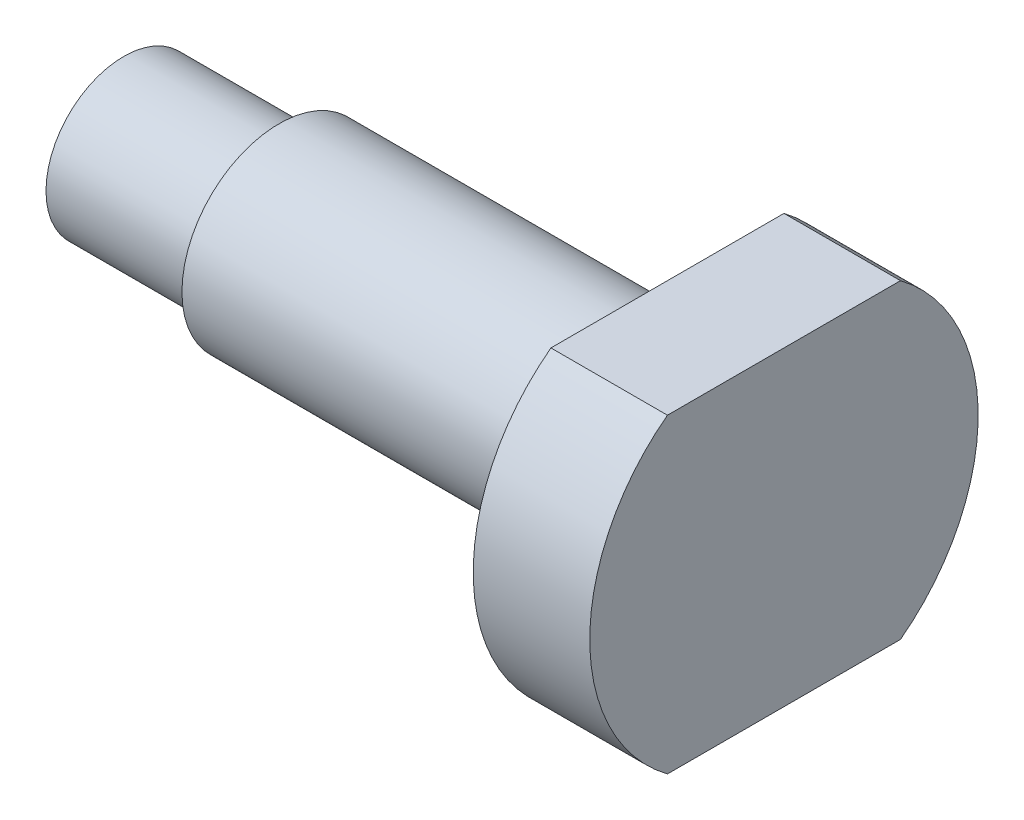
ISO-10303-21;
HEADER;
FILE_DESCRIPTION(('STEP AP214'),'2;1');
FILE_NAME('part.step','',(''),(''),'','','');
FILE_SCHEMA(('AUTOMOTIVE_DESIGN { 1 0 10303 214 1 1 1 1 }'));
ENDSEC;
DATA;
#1=APPLICATION_CONTEXT('core data for automotive mechanical design processes');
#2=APPLICATION_PROTOCOL_DEFINITION('international standard','automotive_design',2000,#1);
#3=PRODUCT_CONTEXT('',#1,'mechanical');
#4=PRODUCT('Part','Part','',(#3));
#5=PRODUCT_RELATED_PRODUCT_CATEGORY('part','',(#4));
#6=PRODUCT_DEFINITION_FORMATION('','',#4);
#7=PRODUCT_DEFINITION_CONTEXT('part definition',#1,'design');
#8=PRODUCT_DEFINITION('design','',#6,#7);
#9=PRODUCT_DEFINITION_SHAPE('','',#8);
#10=(LENGTH_UNIT() NAMED_UNIT(*) SI_UNIT(.MILLI.,.METRE.));
#11=(NAMED_UNIT(*) PLANE_ANGLE_UNIT() SI_UNIT($,.RADIAN.));
#12=(NAMED_UNIT(*) SI_UNIT($,.STERADIAN.) SOLID_ANGLE_UNIT());
#13=UNCERTAINTY_MEASURE_WITH_UNIT(LENGTH_MEASURE(1.E-05),#10,'distance_accuracy_value','');
#14=(GEOMETRIC_REPRESENTATION_CONTEXT(3) GLOBAL_UNCERTAINTY_ASSIGNED_CONTEXT((#13)) GLOBAL_UNIT_ASSIGNED_CONTEXT((#10,
#11,#12)) REPRESENTATION_CONTEXT('',''));
#15=CARTESIAN_POINT('',(0.,0.,0.));
#16=DIRECTION('',(0.,0.,1.));
#17=DIRECTION('',(1.,0.,0.));
#18=AXIS2_PLACEMENT_3D('',#15,#16,#17);
#19=CARTESIAN_POINT('',(3.,-4.,0.));
#20=DIRECTION('',(0.,-1.,0.));
#21=DIRECTION('',(0.,0.,-1.));
#22=AXIS2_PLACEMENT_3D('',#19,#20,#21);
#23=PLANE('',#22);
#24=DIRECTION('',(0.,0.,1.));
#25=VECTOR('',#24,1.);
#26=CARTESIAN_POINT('',(0.,-4.,0.));
#27=LINE('',#26,#25);
#28=CARTESIAN_POINT('',(0.,-4.,-3.));
#29=VERTEX_POINT('',#28);
#30=CARTESIAN_POINT('',(0.,-4.,3.));
#31=VERTEX_POINT('',#30);
#32=EDGE_CURVE('E101',#29,#31,#27,.T.);
#33=ORIENTED_EDGE('',*,*,#32,.F.);
#34=DIRECTION('',(-1.,0.,0.));
#35=VECTOR('',#34,1.);
#36=CARTESIAN_POINT('',(3.,-4.,-3.));
#37=LINE('',#36,#35);
#38=CARTESIAN_POINT('',(3.,-4.,-3.));
#39=VERTEX_POINT('',#38);
#40=EDGE_CURVE('E39',#39,#29,#37,.T.);
#41=ORIENTED_EDGE('',*,*,#40,.F.);
#42=DIRECTION('',(0.,0.,1.));
#43=VECTOR('',#42,1.);
#44=CARTESIAN_POINT('',(3.,-4.,0.));
#45=LINE('',#44,#43);
#46=CARTESIAN_POINT('',(3.,-4.,3.));
#47=VERTEX_POINT('',#46);
#48=EDGE_CURVE('E88',#39,#47,#45,.T.);
#49=ORIENTED_EDGE('',*,*,#48,.T.);
#50=DIRECTION('',(-1.,0.,0.));
#51=VECTOR('',#50,1.);
#52=CARTESIAN_POINT('',(3.,-4.,3.));
#53=LINE('',#52,#51);
#54=EDGE_CURVE('E77',#47,#31,#53,.T.);
#55=ORIENTED_EDGE('',*,*,#54,.T.);
#56=EDGE_LOOP('',(#33,#41,#49,#55));
#57=FACE_BOUND('',#56,.T.);
#58=ADVANCED_FACE('F36',(#57),#23,.T.);
#59=CARTESIAN_POINT('',(3.,0.,0.));
#60=DIRECTION('',(-1.,0.,0.));
#61=DIRECTION('',(0.,0.,1.));
#62=AXIS2_PLACEMENT_3D('',#59,#60,#61);
#63=CYLINDRICAL_SURFACE('',#62,5.);
#64=CARTESIAN_POINT('',(0.,0.,0.));
#65=DIRECTION('',(1.,0.,0.));
#66=DIRECTION('',(0.,0.,-1.));
#67=AXIS2_PLACEMENT_3D('',#64,#65,#66);
#68=CIRCLE('',#67,5.);
#69=CARTESIAN_POINT('',(0.,4.,-3.));
#70=VERTEX_POINT('',#69);
#71=EDGE_CURVE('E94',#29,#70,#68,.T.);
#72=ORIENTED_EDGE('',*,*,#71,.T.);
#73=DIRECTION('',(-1.,0.,0.));
#74=VECTOR('',#73,1.);
#75=CARTESIAN_POINT('',(3.,4.,-3.));
#76=LINE('',#75,#74);
#77=CARTESIAN_POINT('',(3.,4.,-3.));
#78=VERTEX_POINT('',#77);
#79=EDGE_CURVE('E91',#78,#70,#76,.T.);
#80=ORIENTED_EDGE('',*,*,#79,.F.);
#81=CARTESIAN_POINT('',(3.,0.,0.));
#82=DIRECTION('',(1.,0.,0.));
#83=DIRECTION('',(0.,0.,-1.));
#84=AXIS2_PLACEMENT_3D('',#81,#82,#83);
#85=CIRCLE('',#84,5.);
#86=EDGE_CURVE('E83',#39,#78,#85,.T.);
#87=ORIENTED_EDGE('',*,*,#86,.F.);
#88=ORIENTED_EDGE('',*,*,#40,.T.);
#89=EDGE_LOOP('',(#72,#80,#87,#88));
#90=FACE_BOUND('',#89,.T.);
#91=ADVANCED_FACE('F92',(#90),#63,.T.);
#92=CARTESIAN_POINT('',(3.,4.,0.));
#93=DIRECTION('',(0.,-1.,0.));
#94=DIRECTION('',(0.,0.,-1.));
#95=AXIS2_PLACEMENT_3D('',#92,#93,#94);
#96=PLANE('',#95);
#97=DIRECTION('',(0.,0.,1.));
#98=VECTOR('',#97,1.);
#99=CARTESIAN_POINT('',(0.,4.,0.));
#100=LINE('',#99,#98);
#101=CARTESIAN_POINT('',(0.,4.,3.));
#102=VERTEX_POINT('',#101);
#103=EDGE_CURVE('E70',#70,#102,#100,.T.);
#104=ORIENTED_EDGE('',*,*,#103,.T.);
#105=DIRECTION('',(-1.,0.,0.));
#106=VECTOR('',#105,1.);
#107=CARTESIAN_POINT('',(3.,4.,3.));
#108=LINE('',#107,#106);
#109=CARTESIAN_POINT('',(3.,4.,3.));
#110=VERTEX_POINT('',#109);
#111=EDGE_CURVE('E95',#110,#102,#108,.T.);
#112=ORIENTED_EDGE('',*,*,#111,.F.);
#113=DIRECTION('',(0.,0.,1.));
#114=VECTOR('',#113,1.);
#115=CARTESIAN_POINT('',(3.,4.,0.));
#116=LINE('',#115,#114);
#117=EDGE_CURVE('E87',#78,#110,#116,.T.);
#118=ORIENTED_EDGE('',*,*,#117,.F.);
#119=ORIENTED_EDGE('',*,*,#79,.T.);
#120=EDGE_LOOP('',(#104,#112,#118,#119));
#121=FACE_BOUND('',#120,.T.);
#122=ADVANCED_FACE('F96',(#121),#96,.F.);
#123=CARTESIAN_POINT('',(3.,0.,0.));
#124=DIRECTION('',(-1.,0.,0.));
#125=DIRECTION('',(0.,0.,1.));
#126=AXIS2_PLACEMENT_3D('',#123,#124,#125);
#127=CYLINDRICAL_SURFACE('',#126,5.);
#128=CARTESIAN_POINT('',(0.,0.,0.));
#129=DIRECTION('',(1.,0.,0.));
#130=DIRECTION('',(0.,0.,-1.));
#131=AXIS2_PLACEMENT_3D('',#128,#129,#130);
#132=CIRCLE('',#131,5.);
#133=EDGE_CURVE('E107',#102,#31,#132,.T.);
#134=ORIENTED_EDGE('',*,*,#133,.T.);
#135=ORIENTED_EDGE('',*,*,#54,.F.);
#136=CARTESIAN_POINT('',(3.,0.,0.));
#137=DIRECTION('',(1.,0.,0.));
#138=DIRECTION('',(0.,0.,-1.));
#139=AXIS2_PLACEMENT_3D('',#136,#137,#138);
#140=CIRCLE('',#139,5.);
#141=EDGE_CURVE('E53',#110,#47,#140,.T.);
#142=ORIENTED_EDGE('',*,*,#141,.F.);
#143=ORIENTED_EDGE('',*,*,#111,.T.);
#144=EDGE_LOOP('',(#134,#135,#142,#143));
#145=FACE_BOUND('',#144,.T.);
#146=ADVANCED_FACE('F112',(#145),#127,.T.);
#147=CARTESIAN_POINT('',(3.,0.,0.));
#148=DIRECTION('',(1.,0.,0.));
#149=DIRECTION('',(0.,0.,-1.));
#150=AXIS2_PLACEMENT_3D('',#147,#148,#149);
#151=PLANE('',#150);
#152=ORIENTED_EDGE('',*,*,#48,.F.);
#153=ORIENTED_EDGE('',*,*,#86,.T.);
#154=ORIENTED_EDGE('',*,*,#117,.T.);
#155=ORIENTED_EDGE('',*,*,#141,.T.);
#156=EDGE_LOOP('',(#152,#153,#154,#155));
#157=FACE_BOUND('',#156,.T.);
#158=ADVANCED_FACE('F85',(#157),#151,.T.);
#159=CARTESIAN_POINT('',(0.,0.,0.));
#160=DIRECTION('',(1.,0.,0.));
#161=DIRECTION('',(0.,0.,-1.));
#162=AXIS2_PLACEMENT_3D('',#159,#160,#161);
#163=PLANE('',#162);
#164=CARTESIAN_POINT('',(0.,0.,0.));
#165=DIRECTION('',(1.,0.,0.));
#166=DIRECTION('',(0.,0.,-1.));
#167=AXIS2_PLACEMENT_3D('',#164,#165,#166);
#168=CIRCLE('',#167,2.5);
#169=CARTESIAN_POINT('',(0.,0.,-2.5));
#170=VERTEX_POINT('',#169);
#171=EDGE_CURVE('E151',#170,#170,#168,.T.);
#172=ORIENTED_EDGE('',*,*,#171,.T.);
#173=EDGE_LOOP('',(#172));
#174=FACE_BOUND('',#173,.T.);
#175=ORIENTED_EDGE('',*,*,#32,.T.);
#176=ORIENTED_EDGE('',*,*,#133,.F.);
#177=ORIENTED_EDGE('',*,*,#103,.F.);
#178=ORIENTED_EDGE('',*,*,#71,.F.);
#179=EDGE_LOOP('',(#175,#176,#177,#178));
#180=FACE_BOUND('',#179,.T.);
#181=ADVANCED_FACE('F114',(#174,#180),#163,.F.);
#182=CARTESIAN_POINT('',(-10.,0.,0.));
#183=DIRECTION('',(1.,0.,0.));
#184=DIRECTION('',(0.,0.,-1.));
#185=AXIS2_PLACEMENT_3D('',#182,#183,#184);
#186=CYLINDRICAL_SURFACE('',#185,2.5);
#187=CARTESIAN_POINT('',(-10.,0.,0.));
#188=DIRECTION('',(1.,0.,0.));
#189=DIRECTION('',(0.,0.,-1.));
#190=AXIS2_PLACEMENT_3D('',#187,#188,#189);
#191=CIRCLE('',#190,2.5);
#192=CARTESIAN_POINT('',(-10.,0.,-2.5));
#193=VERTEX_POINT('',#192);
#194=EDGE_CURVE('E104',#193,#193,#191,.T.);
#195=ORIENTED_EDGE('',*,*,#194,.T.);
#196=EDGE_LOOP('',(#195));
#197=FACE_BOUND('',#196,.T.);
#198=ORIENTED_EDGE('',*,*,#171,.F.);
#199=EDGE_LOOP('',(#198));
#200=FACE_BOUND('',#199,.T.);
#201=ADVANCED_FACE('F128',(#197,#200),#186,.T.);
#202=CARTESIAN_POINT('',(-10.,0.,0.));
#203=DIRECTION('',(1.,0.,0.));
#204=DIRECTION('',(0.,0.,-1.));
#205=AXIS2_PLACEMENT_3D('',#202,#203,#204);
#206=PLANE('',#205);
#207=CARTESIAN_POINT('',(-10.,0.,0.));
#208=DIRECTION('',(-1.,0.,0.));
#209=DIRECTION('',(0.,0.,1.));
#210=AXIS2_PLACEMENT_3D('',#207,#208,#209);
#211=CIRCLE('',#210,2.);
#212=CARTESIAN_POINT('',(-10.,0.,2.));
#213=VERTEX_POINT('',#212);
#214=EDGE_CURVE('E11',#213,#213,#211,.T.);
#215=ORIENTED_EDGE('',*,*,#214,.F.);
#216=EDGE_LOOP('',(#215));
#217=FACE_BOUND('',#216,.T.);
#218=ORIENTED_EDGE('',*,*,#194,.F.);
#219=EDGE_LOOP('',(#218));
#220=FACE_BOUND('',#219,.T.);
#221=ADVANCED_FACE('F134',(#217,#220),#206,.F.);
#222=CARTESIAN_POINT('',(-14.,0.,0.));
#223=DIRECTION('',(1.,0.,0.));
#224=DIRECTION('',(0.,0.,-1.));
#225=AXIS2_PLACEMENT_3D('',#222,#223,#224);
#226=CYLINDRICAL_SURFACE('',#225,2.);
#227=CARTESIAN_POINT('',(-14.,0.,0.));
#228=DIRECTION('',(-1.,0.,0.));
#229=DIRECTION('',(0.,0.,1.));
#230=AXIS2_PLACEMENT_3D('',#227,#228,#229);
#231=CIRCLE('',#230,2.);
#232=CARTESIAN_POINT('',(-14.,0.,2.));
#233=VERTEX_POINT('',#232);
#234=EDGE_CURVE('E150',#233,#233,#231,.T.);
#235=ORIENTED_EDGE('',*,*,#234,.F.);
#236=EDGE_LOOP('',(#235));
#237=FACE_BOUND('',#236,.T.);
#238=ORIENTED_EDGE('',*,*,#214,.T.);
#239=EDGE_LOOP('',(#238));
#240=FACE_BOUND('',#239,.T.);
#241=ADVANCED_FACE('F138',(#237,#240),#226,.T.);
#242=CARTESIAN_POINT('',(-14.,0.,0.));
#243=DIRECTION('',(-1.,0.,0.));
#244=DIRECTION('',(0.,0.,1.));
#245=AXIS2_PLACEMENT_3D('',#242,#243,#244);
#246=PLANE('',#245);
#247=ORIENTED_EDGE('',*,*,#234,.T.);
#248=EDGE_LOOP('',(#247));
#249=FACE_BOUND('',#248,.T.);
#250=ADVANCED_FACE('F142',(#249),#246,.T.);
#251=CLOSED_SHELL('',(#58,#91,#122,#146,#158,#181,#201,#221,#241,#250));
#252=MANIFOLD_SOLID_BREP('B2',#251);
#253=ADVANCED_BREP_SHAPE_REPRESENTATION('',(#18,#252),#14);
#254=SHAPE_DEFINITION_REPRESENTATION(#9,#253);
ENDSEC;
END-ISO-10303-21;
